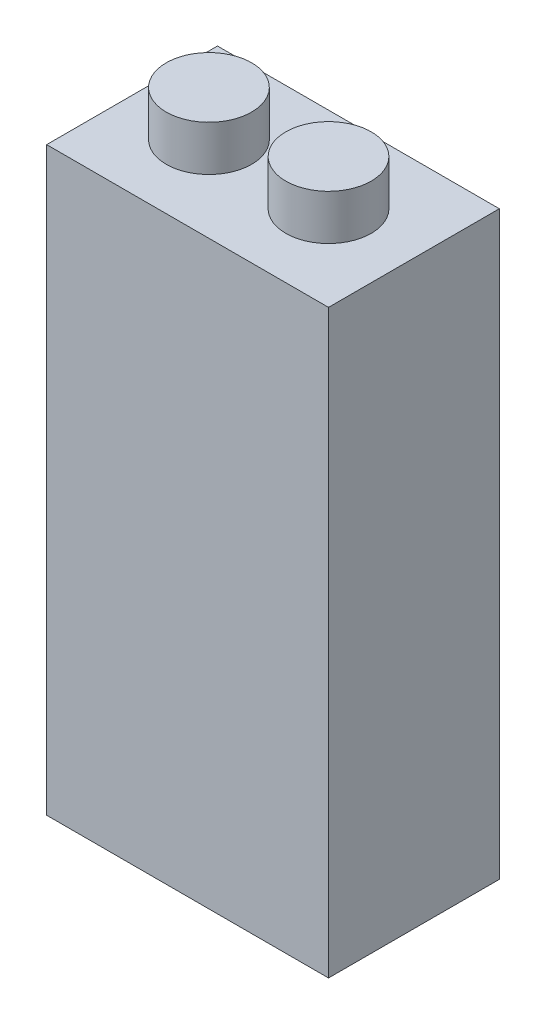
ISO-10303-21;
HEADER;
FILE_DESCRIPTION(('STEP AP214'),'2;1');
FILE_NAME('part.step','',(''),(''),'','','');
FILE_SCHEMA(('AUTOMOTIVE_DESIGN { 1 0 10303 214 1 1 1 1 }'));
ENDSEC;
DATA;
#1=APPLICATION_CONTEXT('core data for automotive mechanical design processes');
#2=APPLICATION_PROTOCOL_DEFINITION('international standard','automotive_design',2000,#1);
#3=PRODUCT_CONTEXT('',#1,'mechanical');
#4=PRODUCT('Part','Part','',(#3));
#5=PRODUCT_RELATED_PRODUCT_CATEGORY('part','',(#4));
#6=PRODUCT_DEFINITION_FORMATION('','',#4);
#7=PRODUCT_DEFINITION_CONTEXT('part definition',#1,'design');
#8=PRODUCT_DEFINITION('design','',#6,#7);
#9=PRODUCT_DEFINITION_SHAPE('','',#8);
#10=(LENGTH_UNIT() NAMED_UNIT(*) SI_UNIT(.MILLI.,.METRE.));
#11=(NAMED_UNIT(*) PLANE_ANGLE_UNIT() SI_UNIT($,.RADIAN.));
#12=(NAMED_UNIT(*) SI_UNIT($,.STERADIAN.) SOLID_ANGLE_UNIT());
#13=UNCERTAINTY_MEASURE_WITH_UNIT(LENGTH_MEASURE(1.E-05),#10,'distance_accuracy_value','');
#14=(GEOMETRIC_REPRESENTATION_CONTEXT(3) GLOBAL_UNCERTAINTY_ASSIGNED_CONTEXT((#13)) GLOBAL_UNIT_ASSIGNED_CONTEXT((#10,
#11,#12)) REPRESENTATION_CONTEXT('',''));
#15=CARTESIAN_POINT('',(0.,0.,0.));
#16=DIRECTION('',(0.,0.,1.));
#17=DIRECTION('',(1.,0.,0.));
#18=AXIS2_PLACEMENT_3D('',#15,#16,#17);
#19=CARTESIAN_POINT('',(-16.5,68.,-10.));
#20=DIRECTION('',(1.,0.,0.));
#21=DIRECTION('',(0.,0.,-1.));
#22=AXIS2_PLACEMENT_3D('',#19,#20,#21);
#23=PLANE('',#22);
#24=DIRECTION('',(0.,0.,1.));
#25=VECTOR('',#24,1.);
#26=CARTESIAN_POINT('',(-16.5,0.,-10.));
#27=LINE('',#26,#25);
#28=CARTESIAN_POINT('',(-16.5,0.,-10.));
#29=VERTEX_POINT('',#28);
#30=CARTESIAN_POINT('',(-16.5,0.,10.));
#31=VERTEX_POINT('',#30);
#32=EDGE_CURVE('E99',#29,#31,#27,.T.);
#33=ORIENTED_EDGE('',*,*,#32,.T.);
#34=DIRECTION('',(0.,-1.,0.));
#35=VECTOR('',#34,1.);
#36=CARTESIAN_POINT('',(-16.5,68.,10.));
#37=LINE('',#36,#35);
#38=CARTESIAN_POINT('',(-16.5,68.,10.));
#39=VERTEX_POINT('',#38);
#40=EDGE_CURVE('E11',#39,#31,#37,.T.);
#41=ORIENTED_EDGE('',*,*,#40,.F.);
#42=DIRECTION('',(0.,0.,1.));
#43=VECTOR('',#42,1.);
#44=CARTESIAN_POINT('',(-16.5,68.,-10.));
#45=LINE('',#44,#43);
#46=CARTESIAN_POINT('',(-16.5,68.,-10.));
#47=VERTEX_POINT('',#46);
#48=EDGE_CURVE('E87',#47,#39,#45,.T.);
#49=ORIENTED_EDGE('',*,*,#48,.F.);
#50=DIRECTION('',(0.,-1.,0.));
#51=VECTOR('',#50,1.);
#52=CARTESIAN_POINT('',(-16.5,68.,-10.));
#53=LINE('',#52,#51);
#54=EDGE_CURVE('E95',#47,#29,#53,.T.);
#55=ORIENTED_EDGE('',*,*,#54,.T.);
#56=EDGE_LOOP('',(#33,#41,#49,#55));
#57=FACE_BOUND('',#56,.T.);
#58=ADVANCED_FACE('F36',(#57),#23,.F.);
#59=CARTESIAN_POINT('',(-16.5,68.,10.));
#60=DIRECTION('',(0.,0.,-1.));
#61=DIRECTION('',(-1.,0.,0.));
#62=AXIS2_PLACEMENT_3D('',#59,#60,#61);
#63=PLANE('',#62);
#64=DIRECTION('',(1.,0.,0.));
#65=VECTOR('',#64,1.);
#66=CARTESIAN_POINT('',(-16.5,0.,10.));
#67=LINE('',#66,#65);
#68=CARTESIAN_POINT('',(16.5,0.,10.));
#69=VERTEX_POINT('',#68);
#70=EDGE_CURVE('E91',#31,#69,#67,.T.);
#71=ORIENTED_EDGE('',*,*,#70,.T.);
#72=DIRECTION('',(0.,-1.,0.));
#73=VECTOR('',#72,1.);
#74=CARTESIAN_POINT('',(16.5,68.,10.));
#75=LINE('',#74,#73);
#76=CARTESIAN_POINT('',(16.5,68.,10.));
#77=VERTEX_POINT('',#76);
#78=EDGE_CURVE('E44',#77,#69,#75,.T.);
#79=ORIENTED_EDGE('',*,*,#78,.F.);
#80=DIRECTION('',(1.,0.,0.));
#81=VECTOR('',#80,1.);
#82=CARTESIAN_POINT('',(-16.5,68.,10.));
#83=LINE('',#82,#81);
#84=EDGE_CURVE('E82',#39,#77,#83,.T.);
#85=ORIENTED_EDGE('',*,*,#84,.F.);
#86=ORIENTED_EDGE('',*,*,#40,.T.);
#87=EDGE_LOOP('',(#71,#79,#85,#86));
#88=FACE_BOUND('',#87,.T.);
#89=ADVANCED_FACE('F90',(#88),#63,.F.);
#90=CARTESIAN_POINT('',(16.5,68.,-10.));
#91=DIRECTION('',(-1.,0.,0.));
#92=DIRECTION('',(0.,0.,1.));
#93=AXIS2_PLACEMENT_3D('',#90,#91,#92);
#94=PLANE('',#93);
#95=DIRECTION('',(0.,0.,-1.));
#96=VECTOR('',#95,1.);
#97=CARTESIAN_POINT('',(16.5,0.,-10.));
#98=LINE('',#97,#96);
#99=CARTESIAN_POINT('',(16.5,0.,-10.));
#100=VERTEX_POINT('',#99);
#101=EDGE_CURVE('E69',#69,#100,#98,.T.);
#102=ORIENTED_EDGE('',*,*,#101,.T.);
#103=DIRECTION('',(0.,-1.,0.));
#104=VECTOR('',#103,1.);
#105=CARTESIAN_POINT('',(16.5,68.,-10.));
#106=LINE('',#105,#104);
#107=CARTESIAN_POINT('',(16.5,68.,-10.));
#108=VERTEX_POINT('',#107);
#109=EDGE_CURVE('E92',#108,#100,#106,.T.);
#110=ORIENTED_EDGE('',*,*,#109,.F.);
#111=DIRECTION('',(0.,0.,-1.));
#112=VECTOR('',#111,1.);
#113=CARTESIAN_POINT('',(16.5,68.,-10.));
#114=LINE('',#113,#112);
#115=EDGE_CURVE('E85',#77,#108,#114,.T.);
#116=ORIENTED_EDGE('',*,*,#115,.F.);
#117=ORIENTED_EDGE('',*,*,#78,.T.);
#118=EDGE_LOOP('',(#102,#110,#116,#117));
#119=FACE_BOUND('',#118,.T.);
#120=ADVANCED_FACE('F93',(#119),#94,.F.);
#121=CARTESIAN_POINT('',(-16.5,68.,-10.));
#122=DIRECTION('',(0.,0.,1.));
#123=DIRECTION('',(1.,0.,0.));
#124=AXIS2_PLACEMENT_3D('',#121,#122,#123);
#125=PLANE('',#124);
#126=DIRECTION('',(-1.,0.,0.));
#127=VECTOR('',#126,1.);
#128=CARTESIAN_POINT('',(-16.5,0.,-10.));
#129=LINE('',#128,#127);
#130=EDGE_CURVE('E75',#100,#29,#129,.T.);
#131=ORIENTED_EDGE('',*,*,#130,.T.);
#132=ORIENTED_EDGE('',*,*,#54,.F.);
#133=DIRECTION('',(-1.,0.,0.));
#134=VECTOR('',#133,1.);
#135=CARTESIAN_POINT('',(-16.5,68.,-10.));
#136=LINE('',#135,#134);
#137=EDGE_CURVE('E52',#108,#47,#136,.T.);
#138=ORIENTED_EDGE('',*,*,#137,.F.);
#139=ORIENTED_EDGE('',*,*,#109,.T.);
#140=EDGE_LOOP('',(#131,#132,#138,#139));
#141=FACE_BOUND('',#140,.T.);
#142=ADVANCED_FACE('F107',(#141),#125,.F.);
#143=CARTESIAN_POINT('',(0.,68.,0.));
#144=DIRECTION('',(0.,1.,0.));
#145=DIRECTION('',(0.,0.,1.));
#146=AXIS2_PLACEMENT_3D('',#143,#144,#145);
#147=PLANE('',#146);
#148=CARTESIAN_POINT('',(6.5,68.,0.));
#149=DIRECTION('',(0.,1.,0.));
#150=DIRECTION('',(0.,0.,1.));
#151=AXIS2_PLACEMENT_3D('',#148,#149,#150);
#152=CIRCLE('',#151,5.);
#153=CARTESIAN_POINT('',(6.5,68.,5.));
#154=VERTEX_POINT('',#153);
#155=EDGE_CURVE('E119',#154,#154,#152,.T.);
#156=ORIENTED_EDGE('',*,*,#155,.F.);
#157=EDGE_LOOP('',(#156));
#158=FACE_BOUND('',#157,.T.);
#159=CARTESIAN_POINT('',(-7.5,68.,0.));
#160=DIRECTION('',(0.,1.,0.));
#161=DIRECTION('',(0.,0.,1.));
#162=AXIS2_PLACEMENT_3D('',#159,#160,#161);
#163=CIRCLE('',#162,5.);
#164=CARTESIAN_POINT('',(-7.5,68.,5.));
#165=VERTEX_POINT('',#164);
#166=EDGE_CURVE('E113',#165,#165,#163,.T.);
#167=ORIENTED_EDGE('',*,*,#166,.F.);
#168=EDGE_LOOP('',(#167));
#169=FACE_BOUND('',#168,.T.);
#170=ORIENTED_EDGE('',*,*,#48,.T.);
#171=ORIENTED_EDGE('',*,*,#84,.T.);
#172=ORIENTED_EDGE('',*,*,#115,.T.);
#173=ORIENTED_EDGE('',*,*,#137,.T.);
#174=EDGE_LOOP('',(#170,#171,#172,#173));
#175=FACE_BOUND('',#174,.T.);
#176=ADVANCED_FACE('F83',(#158,#169,#175),#147,.T.);
#177=CARTESIAN_POINT('',(0.,0.,0.));
#178=DIRECTION('',(0.,1.,0.));
#179=DIRECTION('',(0.,0.,1.));
#180=AXIS2_PLACEMENT_3D('',#177,#178,#179);
#181=PLANE('',#180);
#182=ORIENTED_EDGE('',*,*,#32,.F.);
#183=ORIENTED_EDGE('',*,*,#130,.F.);
#184=ORIENTED_EDGE('',*,*,#101,.F.);
#185=ORIENTED_EDGE('',*,*,#70,.F.);
#186=EDGE_LOOP('',(#182,#183,#184,#185));
#187=FACE_BOUND('',#186,.T.);
#188=ADVANCED_FACE('F110',(#187),#181,.F.);
#189=CARTESIAN_POINT('',(-7.5,73.3,0.));
#190=DIRECTION('',(0.,-1.,0.));
#191=DIRECTION('',(0.,0.,-1.));
#192=AXIS2_PLACEMENT_3D('',#189,#190,#191);
#193=CYLINDRICAL_SURFACE('',#192,5.);
#194=CARTESIAN_POINT('',(-7.5,73.3,0.));
#195=DIRECTION('',(0.,1.,0.));
#196=DIRECTION('',(0.,0.,1.));
#197=AXIS2_PLACEMENT_3D('',#194,#195,#196);
#198=CIRCLE('',#197,5.);
#199=CARTESIAN_POINT('',(-7.5,73.3,5.));
#200=VERTEX_POINT('',#199);
#201=EDGE_CURVE('E102',#200,#200,#198,.T.);
#202=ORIENTED_EDGE('',*,*,#201,.F.);
#203=EDGE_LOOP('',(#202));
#204=FACE_BOUND('',#203,.T.);
#205=ORIENTED_EDGE('',*,*,#166,.T.);
#206=EDGE_LOOP('',(#205));
#207=FACE_BOUND('',#206,.T.);
#208=ADVANCED_FACE('F139',(#204,#207),#193,.T.);
#209=CARTESIAN_POINT('',(-7.5,73.3,0.));
#210=DIRECTION('',(0.,1.,0.));
#211=DIRECTION('',(0.,0.,1.));
#212=AXIS2_PLACEMENT_3D('',#209,#210,#211);
#213=PLANE('',#212);
#214=ORIENTED_EDGE('',*,*,#201,.T.);
#215=EDGE_LOOP('',(#214));
#216=FACE_BOUND('',#215,.T.);
#217=ADVANCED_FACE('F130',(#216),#213,.T.);
#218=CARTESIAN_POINT('',(6.5,73.3,0.));
#219=DIRECTION('',(0.,-1.,0.));
#220=DIRECTION('',(0.,0.,-1.));
#221=AXIS2_PLACEMENT_3D('',#218,#219,#220);
#222=CYLINDRICAL_SURFACE('',#221,5.);
#223=CARTESIAN_POINT('',(6.5,73.3,0.));
#224=DIRECTION('',(0.,1.,0.));
#225=DIRECTION('',(0.,0.,1.));
#226=AXIS2_PLACEMENT_3D('',#223,#224,#225);
#227=CIRCLE('',#226,5.);
#228=CARTESIAN_POINT('',(6.5,73.3,5.));
#229=VERTEX_POINT('',#228);
#230=EDGE_CURVE('E116',#229,#229,#227,.T.);
#231=ORIENTED_EDGE('',*,*,#230,.F.);
#232=EDGE_LOOP('',(#231));
#233=FACE_BOUND('',#232,.T.);
#234=ORIENTED_EDGE('',*,*,#155,.T.);
#235=EDGE_LOOP('',(#234));
#236=FACE_BOUND('',#235,.T.);
#237=ADVANCED_FACE('F127',(#233,#236),#222,.T.);
#238=CARTESIAN_POINT('',(6.5,73.3,0.));
#239=DIRECTION('',(0.,1.,0.));
#240=DIRECTION('',(0.,0.,1.));
#241=AXIS2_PLACEMENT_3D('',#238,#239,#240);
#242=PLANE('',#241);
#243=ORIENTED_EDGE('',*,*,#230,.T.);
#244=EDGE_LOOP('',(#243));
#245=FACE_BOUND('',#244,.T.);
#246=ADVANCED_FACE('F125',(#245),#242,.T.);
#247=CLOSED_SHELL('',(#58,#89,#120,#142,#176,#188,#208,#217,#237,#246));
#248=MANIFOLD_SOLID_BREP('B2',#247);
#249=ADVANCED_BREP_SHAPE_REPRESENTATION('',(#18,#248),#14);
#250=SHAPE_DEFINITION_REPRESENTATION(#9,#249);
ENDSEC;
END-ISO-10303-21;
